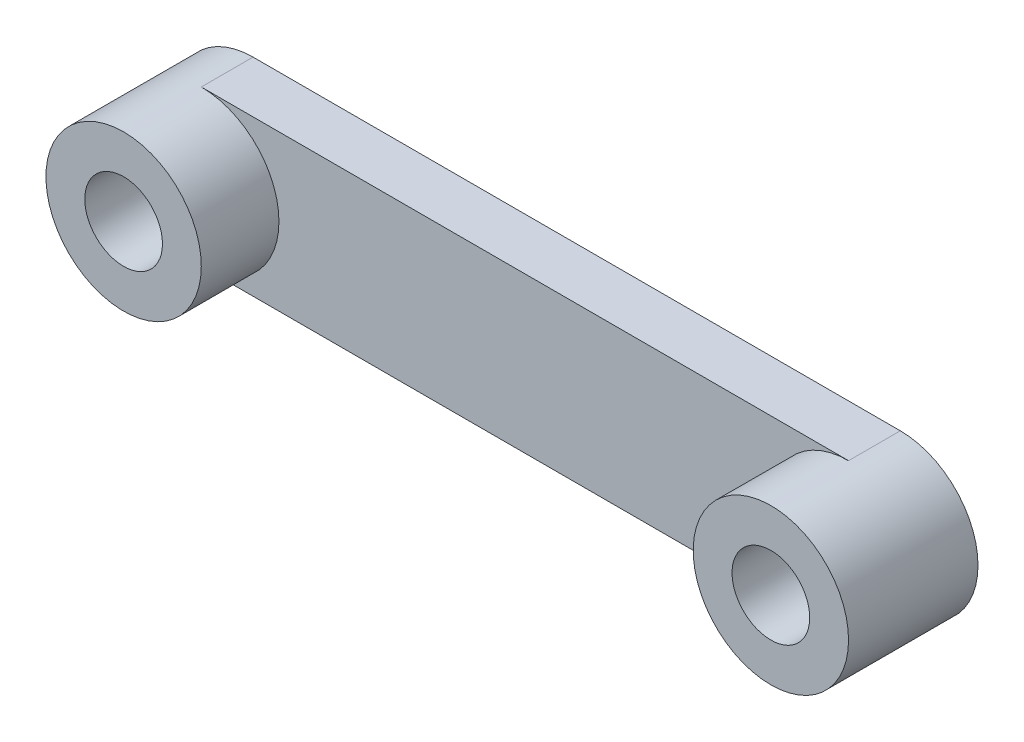
ISO-10303-21;
HEADER;
FILE_DESCRIPTION(('STEP AP214'),'2;1');
FILE_NAME('part.step','',(''),(''),'','','');
FILE_SCHEMA(('AUTOMOTIVE_DESIGN { 1 0 10303 214 1 1 1 1 }'));
ENDSEC;
DATA;
#1=APPLICATION_CONTEXT('core data for automotive mechanical design processes');
#2=APPLICATION_PROTOCOL_DEFINITION('international standard','automotive_design',2000,#1);
#3=PRODUCT_CONTEXT('',#1,'mechanical');
#4=PRODUCT('Part','Part','',(#3));
#5=PRODUCT_RELATED_PRODUCT_CATEGORY('part','',(#4));
#6=PRODUCT_DEFINITION_FORMATION('','',#4);
#7=PRODUCT_DEFINITION_CONTEXT('part definition',#1,'design');
#8=PRODUCT_DEFINITION('design','',#6,#7);
#9=PRODUCT_DEFINITION_SHAPE('','',#8);
#10=(LENGTH_UNIT() NAMED_UNIT(*) SI_UNIT(.MILLI.,.METRE.));
#11=(NAMED_UNIT(*) PLANE_ANGLE_UNIT() SI_UNIT($,.RADIAN.));
#12=(NAMED_UNIT(*) SI_UNIT($,.STERADIAN.) SOLID_ANGLE_UNIT());
#13=UNCERTAINTY_MEASURE_WITH_UNIT(LENGTH_MEASURE(1.E-05),#10,'distance_accuracy_value','');
#14=(GEOMETRIC_REPRESENTATION_CONTEXT(3) GLOBAL_UNCERTAINTY_ASSIGNED_CONTEXT((#13)) GLOBAL_UNIT_ASSIGNED_CONTEXT((#10,
#11,#12)) REPRESENTATION_CONTEXT('',''));
#15=CARTESIAN_POINT('',(0.,0.,0.));
#16=DIRECTION('',(0.,0.,1.));
#17=DIRECTION('',(1.,0.,0.));
#18=AXIS2_PLACEMENT_3D('',#15,#16,#17);
#19=CARTESIAN_POINT('',(0.,0.,1.));
#20=DIRECTION('',(0.,0.,1.));
#21=DIRECTION('',(1.,0.,0.));
#22=AXIS2_PLACEMENT_3D('',#19,#20,#21);
#23=PLANE('',#22);
#24=DIRECTION('',(1.,0.,0.));
#25=VECTOR('',#24,1.);
#26=CARTESIAN_POINT('',(0.,3.,1.));
#27=LINE('',#26,#25);
#28=CARTESIAN_POINT('',(-12.5,3.,1.));
#29=VERTEX_POINT('',#28);
#30=CARTESIAN_POINT('',(12.5,3.,1.));
#31=VERTEX_POINT('',#30);
#32=EDGE_CURVE('E116',#29,#31,#27,.T.);
#33=ORIENTED_EDGE('',*,*,#32,.F.);
#34=CARTESIAN_POINT('',(-12.5,0.,1.));
#35=DIRECTION('',(0.,0.,1.));
#36=DIRECTION('',(1.,0.,0.));
#37=AXIS2_PLACEMENT_3D('',#34,#35,#36);
#38=CIRCLE('',#37,3.);
#39=CARTESIAN_POINT('',(-12.5,-3.,1.));
#40=VERTEX_POINT('',#39);
#41=EDGE_CURVE('E88',#29,#40,#38,.F.);
#42=ORIENTED_EDGE('',*,*,#41,.T.);
#43=DIRECTION('',(1.,0.,0.));
#44=VECTOR('',#43,1.);
#45=CARTESIAN_POINT('',(0.,-3.,1.));
#46=LINE('',#45,#44);
#47=CARTESIAN_POINT('',(12.5,-2.99999999999999,1.));
#48=VERTEX_POINT('',#47);
#49=EDGE_CURVE('E115',#40,#48,#46,.T.);
#50=ORIENTED_EDGE('',*,*,#49,.T.);
#51=CARTESIAN_POINT('',(12.5,0.,1.));
#52=DIRECTION('',(0.,0.,1.));
#53=DIRECTION('',(1.,0.,0.));
#54=AXIS2_PLACEMENT_3D('',#51,#52,#53);
#55=CIRCLE('',#54,3.);
#56=EDGE_CURVE('E12',#48,#31,#55,.F.);
#57=ORIENTED_EDGE('',*,*,#56,.T.);
#58=EDGE_LOOP('',(#33,#42,#50,#57));
#59=FACE_BOUND('',#58,.T.);
#60=ADVANCED_FACE('F71',(#59),#23,.T.);
#61=CARTESIAN_POINT('',(12.5,0.,1.));
#62=DIRECTION('',(0.,0.,-1.));
#63=DIRECTION('',(-1.,0.,0.));
#64=AXIS2_PLACEMENT_3D('',#61,#62,#63);
#65=CYLINDRICAL_SURFACE('',#64,1.5);
#66=CARTESIAN_POINT('',(12.5,0.,4.));
#67=DIRECTION('',(0.,0.,1.));
#68=DIRECTION('',(1.,0.,0.));
#69=AXIS2_PLACEMENT_3D('',#66,#67,#68);
#70=CIRCLE('',#69,1.5);
#71=CARTESIAN_POINT('',(14.,0.,4.));
#72=VERTEX_POINT('',#71);
#73=EDGE_CURVE('E148',#72,#72,#70,.T.);
#74=ORIENTED_EDGE('',*,*,#73,.T.);
#75=EDGE_LOOP('',(#74));
#76=FACE_BOUND('',#75,.T.);
#77=CARTESIAN_POINT('',(12.5,0.,-1.));
#78=DIRECTION('',(0.,0.,1.));
#79=DIRECTION('',(1.,0.,0.));
#80=AXIS2_PLACEMENT_3D('',#77,#78,#79);
#81=CIRCLE('',#80,1.5);
#82=CARTESIAN_POINT('',(14.,0.,-1.));
#83=VERTEX_POINT('',#82);
#84=EDGE_CURVE('E136',#83,#83,#81,.T.);
#85=ORIENTED_EDGE('',*,*,#84,.F.);
#86=EDGE_LOOP('',(#85));
#87=FACE_BOUND('',#86,.T.);
#88=ADVANCED_FACE('F165',(#76,#87),#65,.F.);
#89=CARTESIAN_POINT('',(12.5,0.,1.));
#90=DIRECTION('',(0.,0.,-1.));
#91=DIRECTION('',(-1.,0.,0.));
#92=AXIS2_PLACEMENT_3D('',#89,#90,#91);
#93=CYLINDRICAL_SURFACE('',#92,3.);
#94=DIRECTION('',(0.,0.,-1.));
#95=VECTOR('',#94,1.);
#96=CARTESIAN_POINT('',(12.5,-2.99999999999999,1.));
#97=LINE('',#96,#95);
#98=CARTESIAN_POINT('',(12.5,-2.99999999999999,-1.));
#99=VERTEX_POINT('',#98);
#100=EDGE_CURVE('E80',#48,#99,#97,.T.);
#101=ORIENTED_EDGE('',*,*,#100,.T.);
#102=CARTESIAN_POINT('',(12.5,0.,-1.));
#103=DIRECTION('',(0.,0.,1.));
#104=DIRECTION('',(1.,0.,0.));
#105=AXIS2_PLACEMENT_3D('',#102,#103,#104);
#106=CIRCLE('',#105,3.);
#107=CARTESIAN_POINT('',(12.5,3.,-1.));
#108=VERTEX_POINT('',#107);
#109=EDGE_CURVE('E128',#99,#108,#106,.T.);
#110=ORIENTED_EDGE('',*,*,#109,.T.);
#111=DIRECTION('',(0.,0.,-1.));
#112=VECTOR('',#111,1.);
#113=CARTESIAN_POINT('',(12.5,3.,1.));
#114=LINE('',#113,#112);
#115=EDGE_CURVE('E140',#31,#108,#114,.T.);
#116=ORIENTED_EDGE('',*,*,#115,.F.);
#117=ORIENTED_EDGE('',*,*,#56,.F.);
#118=EDGE_LOOP('',(#101,#110,#116,#117));
#119=FACE_BOUND('',#118,.T.);
#120=CARTESIAN_POINT('',(12.5,0.,4.));
#121=DIRECTION('',(0.,0.,1.));
#122=DIRECTION('',(1.,0.,0.));
#123=AXIS2_PLACEMENT_3D('',#120,#121,#122);
#124=CIRCLE('',#123,3.);
#125=CARTESIAN_POINT('',(15.5,0.,4.));
#126=VERTEX_POINT('',#125);
#127=EDGE_CURVE('E144',#126,#126,#124,.T.);
#128=ORIENTED_EDGE('',*,*,#127,.F.);
#129=EDGE_LOOP('',(#128));
#130=FACE_BOUND('',#129,.T.);
#131=ADVANCED_FACE('F162',(#119,#130),#93,.T.);
#132=CARTESIAN_POINT('',(0.,3.,1.));
#133=DIRECTION('',(0.,1.,0.));
#134=DIRECTION('',(-1.,0.,0.));
#135=AXIS2_PLACEMENT_3D('',#132,#133,#134);
#136=PLANE('',#135);
#137=DIRECTION('',(1.,0.,0.));
#138=VECTOR('',#137,1.);
#139=CARTESIAN_POINT('',(0.,3.,-1.));
#140=LINE('',#139,#138);
#141=CARTESIAN_POINT('',(-12.5,3.,-1.));
#142=VERTEX_POINT('',#141);
#143=EDGE_CURVE('E130',#142,#108,#140,.T.);
#144=ORIENTED_EDGE('',*,*,#143,.F.);
#145=DIRECTION('',(0.,0.,-1.));
#146=VECTOR('',#145,1.);
#147=CARTESIAN_POINT('',(-12.5,3.,1.));
#148=LINE('',#147,#146);
#149=EDGE_CURVE('E104',#29,#142,#148,.T.);
#150=ORIENTED_EDGE('',*,*,#149,.F.);
#151=ORIENTED_EDGE('',*,*,#32,.T.);
#152=ORIENTED_EDGE('',*,*,#115,.T.);
#153=EDGE_LOOP('',(#144,#150,#151,#152));
#154=FACE_BOUND('',#153,.T.);
#155=ADVANCED_FACE('F158',(#154),#136,.T.);
#156=CARTESIAN_POINT('',(0.,-3.,1.));
#157=DIRECTION('',(0.,1.,0.));
#158=DIRECTION('',(-1.,0.,0.));
#159=AXIS2_PLACEMENT_3D('',#156,#157,#158);
#160=PLANE('',#159);
#161=DIRECTION('',(1.,0.,0.));
#162=VECTOR('',#161,1.);
#163=CARTESIAN_POINT('',(0.,-3.,-1.));
#164=LINE('',#163,#162);
#165=CARTESIAN_POINT('',(-12.5,-3.,-1.));
#166=VERTEX_POINT('',#165);
#167=EDGE_CURVE('E114',#166,#99,#164,.T.);
#168=ORIENTED_EDGE('',*,*,#167,.T.);
#169=ORIENTED_EDGE('',*,*,#100,.F.);
#170=ORIENTED_EDGE('',*,*,#49,.F.);
#171=DIRECTION('',(0.,0.,-1.));
#172=VECTOR('',#171,1.);
#173=CARTESIAN_POINT('',(-12.5,-3.,1.));
#174=LINE('',#173,#172);
#175=EDGE_CURVE('E110',#40,#166,#174,.T.);
#176=ORIENTED_EDGE('',*,*,#175,.T.);
#177=EDGE_LOOP('',(#168,#169,#170,#176));
#178=FACE_BOUND('',#177,.T.);
#179=ADVANCED_FACE('F111',(#178),#160,.F.);
#180=CARTESIAN_POINT('',(0.,0.,-1.));
#181=DIRECTION('',(0.,0.,1.));
#182=DIRECTION('',(1.,0.,0.));
#183=AXIS2_PLACEMENT_3D('',#180,#181,#182);
#184=PLANE('',#183);
#185=ORIENTED_EDGE('',*,*,#167,.F.);
#186=CARTESIAN_POINT('',(-12.5,0.,-1.));
#187=DIRECTION('',(0.,0.,1.));
#188=DIRECTION('',(1.,0.,0.));
#189=AXIS2_PLACEMENT_3D('',#186,#187,#188);
#190=CIRCLE('',#189,3.);
#191=EDGE_CURVE('E118',#142,#166,#190,.T.);
#192=ORIENTED_EDGE('',*,*,#191,.F.);
#193=ORIENTED_EDGE('',*,*,#143,.T.);
#194=ORIENTED_EDGE('',*,*,#109,.F.);
#195=EDGE_LOOP('',(#185,#192,#193,#194));
#196=FACE_BOUND('',#195,.T.);
#197=ORIENTED_EDGE('',*,*,#84,.T.);
#198=EDGE_LOOP('',(#197));
#199=FACE_BOUND('',#198,.T.);
#200=CARTESIAN_POINT('',(-12.5,0.,-1.));
#201=DIRECTION('',(0.,0.,1.));
#202=DIRECTION('',(1.,0.,0.));
#203=AXIS2_PLACEMENT_3D('',#200,#201,#202);
#204=CIRCLE('',#203,1.5);
#205=CARTESIAN_POINT('',(-11.,0.,-1.));
#206=VERTEX_POINT('',#205);
#207=EDGE_CURVE('E123',#206,#206,#204,.T.);
#208=ORIENTED_EDGE('',*,*,#207,.T.);
#209=EDGE_LOOP('',(#208));
#210=FACE_BOUND('',#209,.T.);
#211=ADVANCED_FACE('F125',(#196,#199,#210),#184,.F.);
#212=CARTESIAN_POINT('',(-12.5,0.,1.));
#213=DIRECTION('',(0.,0.,-1.));
#214=DIRECTION('',(-1.,0.,0.));
#215=AXIS2_PLACEMENT_3D('',#212,#213,#214);
#216=CYLINDRICAL_SURFACE('',#215,1.5);
#217=ORIENTED_EDGE('',*,*,#207,.F.);
#218=EDGE_LOOP('',(#217));
#219=FACE_BOUND('',#218,.T.);
#220=CARTESIAN_POINT('',(-12.5,0.,4.));
#221=DIRECTION('',(0.,0.,1.));
#222=DIRECTION('',(1.,0.,0.));
#223=AXIS2_PLACEMENT_3D('',#220,#221,#222);
#224=CIRCLE('',#223,1.5);
#225=CARTESIAN_POINT('',(-11.,0.,4.));
#226=VERTEX_POINT('',#225);
#227=EDGE_CURVE('E205',#226,#226,#224,.T.);
#228=ORIENTED_EDGE('',*,*,#227,.T.);
#229=EDGE_LOOP('',(#228));
#230=FACE_BOUND('',#229,.T.);
#231=ADVANCED_FACE('F177',(#219,#230),#216,.F.);
#232=CARTESIAN_POINT('',(-12.5,0.,1.));
#233=DIRECTION('',(0.,0.,-1.));
#234=DIRECTION('',(-1.,0.,0.));
#235=AXIS2_PLACEMENT_3D('',#232,#233,#234);
#236=CYLINDRICAL_SURFACE('',#235,3.);
#237=ORIENTED_EDGE('',*,*,#149,.T.);
#238=ORIENTED_EDGE('',*,*,#191,.T.);
#239=ORIENTED_EDGE('',*,*,#175,.F.);
#240=ORIENTED_EDGE('',*,*,#41,.F.);
#241=EDGE_LOOP('',(#237,#238,#239,#240));
#242=FACE_BOUND('',#241,.T.);
#243=CARTESIAN_POINT('',(-12.5,0.,4.));
#244=DIRECTION('',(0.,0.,1.));
#245=DIRECTION('',(1.,0.,0.));
#246=AXIS2_PLACEMENT_3D('',#243,#244,#245);
#247=CIRCLE('',#246,3.);
#248=CARTESIAN_POINT('',(-9.5,0.,4.));
#249=VERTEX_POINT('',#248);
#250=EDGE_CURVE('E208',#249,#249,#247,.T.);
#251=ORIENTED_EDGE('',*,*,#250,.F.);
#252=EDGE_LOOP('',(#251));
#253=FACE_BOUND('',#252,.T.);
#254=ADVANCED_FACE('F73',(#242,#253),#236,.T.);
#255=CARTESIAN_POINT('',(0.,0.,4.));
#256=DIRECTION('',(0.,0.,1.));
#257=DIRECTION('',(1.,0.,0.));
#258=AXIS2_PLACEMENT_3D('',#255,#256,#257);
#259=PLANE('',#258);
#260=ORIENTED_EDGE('',*,*,#73,.F.);
#261=EDGE_LOOP('',(#260));
#262=FACE_BOUND('',#261,.T.);
#263=ORIENTED_EDGE('',*,*,#127,.T.);
#264=EDGE_LOOP('',(#263));
#265=FACE_BOUND('',#264,.T.);
#266=ADVANCED_FACE('F174',(#262,#265),#259,.T.);
#267=CARTESIAN_POINT('',(0.,0.,4.));
#268=DIRECTION('',(0.,0.,1.));
#269=DIRECTION('',(1.,0.,0.));
#270=AXIS2_PLACEMENT_3D('',#267,#268,#269);
#271=PLANE('',#270);
#272=ORIENTED_EDGE('',*,*,#227,.F.);
#273=EDGE_LOOP('',(#272));
#274=FACE_BOUND('',#273,.T.);
#275=ORIENTED_EDGE('',*,*,#250,.T.);
#276=EDGE_LOOP('',(#275));
#277=FACE_BOUND('',#276,.T.);
#278=ADVANCED_FACE('F191',(#274,#277),#271,.T.);
#279=CLOSED_SHELL('',(#60,#88,#131,#155,#179,#211,#231,#254,#266,#278));
#280=MANIFOLD_SOLID_BREP('B2',#279);
#281=ADVANCED_BREP_SHAPE_REPRESENTATION('',(#18,#280),#14);
#282=SHAPE_DEFINITION_REPRESENTATION(#9,#281);
ENDSEC;
END-ISO-10303-21;
